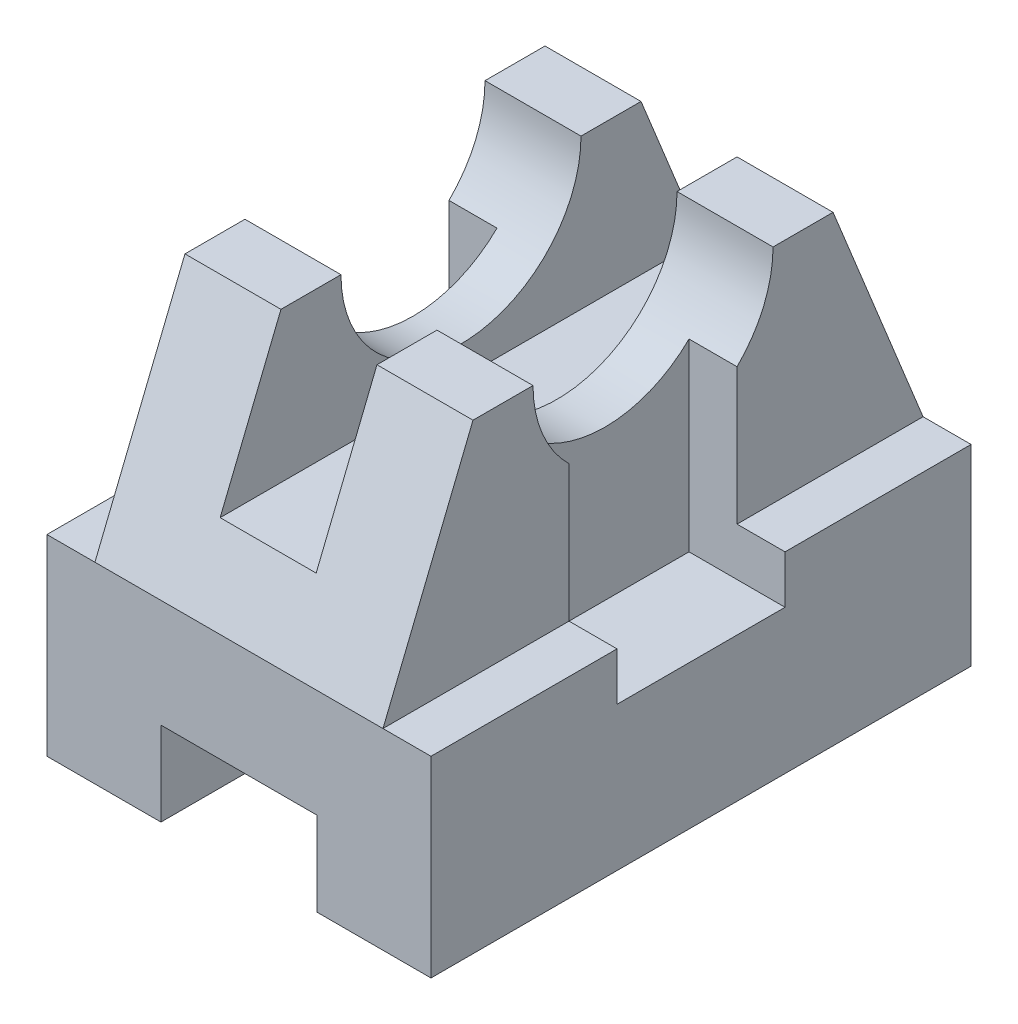
ISO-10303-21;
HEADER;
FILE_DESCRIPTION(('STEP AP214'),'2;1');
FILE_NAME('part.step','',(''),(''),'','','');
FILE_SCHEMA(('AUTOMOTIVE_DESIGN { 1 0 10303 214 1 1 1 1 }'));
ENDSEC;
DATA;
#1=APPLICATION_CONTEXT('core data for automotive mechanical design processes');
#2=APPLICATION_PROTOCOL_DEFINITION('international standard','automotive_design',2000,#1);
#3=PRODUCT_CONTEXT('',#1,'mechanical');
#4=PRODUCT('Part','Part','',(#3));
#5=PRODUCT_RELATED_PRODUCT_CATEGORY('part','',(#4));
#6=PRODUCT_DEFINITION_FORMATION('','',#4);
#7=PRODUCT_DEFINITION_CONTEXT('part definition',#1,'design');
#8=PRODUCT_DEFINITION('design','',#6,#7);
#9=PRODUCT_DEFINITION_SHAPE('','',#8);
#10=(LENGTH_UNIT() NAMED_UNIT(*) SI_UNIT(.MILLI.,.METRE.));
#11=(NAMED_UNIT(*) PLANE_ANGLE_UNIT() SI_UNIT($,.RADIAN.));
#12=(NAMED_UNIT(*) SI_UNIT($,.STERADIAN.) SOLID_ANGLE_UNIT());
#13=UNCERTAINTY_MEASURE_WITH_UNIT(LENGTH_MEASURE(1.E-05),#10,'distance_accuracy_value','');
#14=(GEOMETRIC_REPRESENTATION_CONTEXT(3) GLOBAL_UNCERTAINTY_ASSIGNED_CONTEXT((#13)) GLOBAL_UNIT_ASSIGNED_CONTEXT((#10,
#11,#12)) REPRESENTATION_CONTEXT('',''));
#15=CARTESIAN_POINT('',(0.,0.,0.));
#16=DIRECTION('',(0.,0.,1.));
#17=DIRECTION('',(1.,0.,0.));
#18=AXIS2_PLACEMENT_3D('',#15,#16,#17);
#19=CARTESIAN_POINT('',(32.,32.,45.));
#20=DIRECTION('',(0.,-1.,0.));
#21=DIRECTION('',(0.,0.,-1.));
#22=AXIS2_PLACEMENT_3D('',#19,#20,#21);
#23=PLANE('',#22);
#24=DIRECTION('',(-1.,0.,0.));
#25=VECTOR('',#24,1.);
#26=CARTESIAN_POINT('',(32.,32.,-14.));
#27=LINE('',#26,#25);
#28=CARTESIAN_POINT('',(32.,32.,-14.));
#29=VERTEX_POINT('',#28);
#30=CARTESIAN_POINT('',(24.,32.,-14.));
#31=VERTEX_POINT('',#30);
#32=EDGE_CURVE('E312',#29,#31,#27,.T.);
#33=ORIENTED_EDGE('',*,*,#32,.F.);
#34=DIRECTION('',(0.,0.,-1.));
#35=VECTOR('',#34,1.);
#36=CARTESIAN_POINT('',(32.,32.,45.));
#37=LINE('',#36,#35);
#38=CARTESIAN_POINT('',(32.,32.,-45.));
#39=VERTEX_POINT('',#38);
#40=EDGE_CURVE('E446',#29,#39,#37,.T.);
#41=ORIENTED_EDGE('',*,*,#40,.T.);
#42=DIRECTION('',(-1.,0.,0.));
#43=VECTOR('',#42,1.);
#44=CARTESIAN_POINT('',(32.,32.,-45.));
#45=LINE('',#44,#43);
#46=CARTESIAN_POINT('',(24.,32.,-45.));
#47=VERTEX_POINT('',#46);
#48=EDGE_CURVE('E408',#39,#47,#45,.T.);
#49=ORIENTED_EDGE('',*,*,#48,.T.);
#50=DIRECTION('',(0.,0.,-1.));
#51=VECTOR('',#50,1.);
#52=CARTESIAN_POINT('',(24.,32.,45.));
#53=LINE('',#52,#51);
#54=EDGE_CURVE('E370',#31,#47,#53,.T.);
#55=ORIENTED_EDGE('',*,*,#54,.F.);
#56=EDGE_LOOP('',(#33,#41,#49,#55));
#57=FACE_BOUND('',#56,.T.);
#58=ADVANCED_FACE('F43',(#57),#23,.F.);
#59=DIRECTION('',(-1.,0.,0.));
#60=VECTOR('',#59,1.);
#61=CARTESIAN_POINT('',(32.,32.,-14.));
#62=LINE('',#61,#60);
#63=CARTESIAN_POINT('',(-24.,32.,-14.));
#64=VERTEX_POINT('',#63);
#65=CARTESIAN_POINT('',(-32.,32.,-14.));
#66=VERTEX_POINT('',#65);
#67=EDGE_CURVE('E260',#64,#66,#62,.T.);
#68=ORIENTED_EDGE('',*,*,#67,.F.);
#69=DIRECTION('',(0.,0.,-1.));
#70=VECTOR('',#69,1.);
#71=CARTESIAN_POINT('',(-24.,32.,45.));
#72=LINE('',#71,#70);
#73=CARTESIAN_POINT('',(-24.,32.,-45.));
#74=VERTEX_POINT('',#73);
#75=EDGE_CURVE('E381',#64,#74,#72,.T.);
#76=ORIENTED_EDGE('',*,*,#75,.T.);
#77=CARTESIAN_POINT('',(-32.,32.,-45.));
#78=VERTEX_POINT('',#77);
#79=EDGE_CURVE('E442',#74,#78,#45,.T.);
#80=ORIENTED_EDGE('',*,*,#79,.T.);
#81=DIRECTION('',(0.,0.,-1.));
#82=VECTOR('',#81,1.);
#83=CARTESIAN_POINT('',(-32.,32.,45.));
#84=LINE('',#83,#82);
#85=EDGE_CURVE('E422',#66,#78,#84,.T.);
#86=ORIENTED_EDGE('',*,*,#85,.F.);
#87=EDGE_LOOP('',(#68,#76,#80,#86));
#88=FACE_BOUND('',#87,.T.);
#89=ADVANCED_FACE('F560',(#88),#23,.F.);
#90=CARTESIAN_POINT('',(24.,0.,0.));
#91=DIRECTION('',(1.,0.,0.));
#92=DIRECTION('',(0.,0.,-1.));
#93=AXIS2_PLACEMENT_3D('',#90,#91,#92);
#94=PLANE('',#93);
#95=CARTESIAN_POINT('',(24.,69.,0.));
#96=DIRECTION('',(1.,0.,0.));
#97=DIRECTION('',(0.,0.,-1.));
#98=AXIS2_PLACEMENT_3D('',#95,#96,#97);
#99=CIRCLE('',#98,20.);
#100=CARTESIAN_POINT('',(24.,54.7171431429143,-14.));
#101=VERTEX_POINT('',#100);
#102=CARTESIAN_POINT('',(24.,69.,-20.));
#103=VERTEX_POINT('',#102);
#104=EDGE_CURVE('E320',#101,#103,#99,.T.);
#105=ORIENTED_EDGE('',*,*,#104,.F.);
#106=DIRECTION('',(0.,-1.,0.));
#107=VECTOR('',#106,1.);
#108=CARTESIAN_POINT('',(24.,0.,-14.));
#109=LINE('',#108,#107);
#110=EDGE_CURVE('E315',#101,#31,#109,.T.);
#111=ORIENTED_EDGE('',*,*,#110,.T.);
#112=ORIENTED_EDGE('',*,*,#54,.T.);
#113=DIRECTION('',(0.,0.926739268223405,0.375705108739218));
#114=VECTOR('',#113,1.);
#115=CARTESIAN_POINT('',(24.,32.,-45.));
#116=LINE('',#115,#114);
#117=CARTESIAN_POINT('',(24.,69.,-30.));
#118=VERTEX_POINT('',#117);
#119=EDGE_CURVE('E375',#47,#118,#116,.T.);
#120=ORIENTED_EDGE('',*,*,#119,.T.);
#121=DIRECTION('',(0.,0.,1.));
#122=VECTOR('',#121,1.);
#123=CARTESIAN_POINT('',(24.,69.,-30.));
#124=LINE('',#123,#122);
#125=EDGE_CURVE('E374',#118,#103,#124,.T.);
#126=ORIENTED_EDGE('',*,*,#125,.T.);
#127=EDGE_LOOP('',(#105,#111,#112,#120,#126));
#128=FACE_BOUND('',#127,.T.);
#129=ADVANCED_FACE('F504',(#128),#94,.T.);
#130=CARTESIAN_POINT('',(-24.,0.,0.));
#131=DIRECTION('',(1.,0.,0.));
#132=DIRECTION('',(0.,0.,-1.));
#133=AXIS2_PLACEMENT_3D('',#130,#131,#132);
#134=PLANE('',#133);
#135=DIRECTION('',(0.,-1.,0.));
#136=VECTOR('',#135,1.);
#137=CARTESIAN_POINT('',(-24.,0.,-14.));
#138=LINE('',#137,#136);
#139=CARTESIAN_POINT('',(-24.,54.7171431429143,-14.));
#140=VERTEX_POINT('',#139);
#141=EDGE_CURVE('E303',#140,#64,#138,.T.);
#142=ORIENTED_EDGE('',*,*,#141,.F.);
#143=CARTESIAN_POINT('',(-24.,69.,0.));
#144=DIRECTION('',(1.,0.,0.));
#145=DIRECTION('',(0.,0.,-1.));
#146=AXIS2_PLACEMENT_3D('',#143,#144,#145);
#147=CIRCLE('',#146,20.);
#148=CARTESIAN_POINT('',(-24.,69.,-20.));
#149=VERTEX_POINT('',#148);
#150=EDGE_CURVE('E336',#140,#149,#147,.T.);
#151=ORIENTED_EDGE('',*,*,#150,.T.);
#152=DIRECTION('',(0.,0.,1.));
#153=VECTOR('',#152,1.);
#154=CARTESIAN_POINT('',(-24.,69.,-30.));
#155=LINE('',#154,#153);
#156=CARTESIAN_POINT('',(-24.,69.,-30.));
#157=VERTEX_POINT('',#156);
#158=EDGE_CURVE('E366',#157,#149,#155,.T.);
#159=ORIENTED_EDGE('',*,*,#158,.F.);
#160=DIRECTION('',(0.,0.926739268223405,0.375705108739218));
#161=VECTOR('',#160,1.);
#162=CARTESIAN_POINT('',(-24.,32.,-45.));
#163=LINE('',#162,#161);
#164=EDGE_CURVE('E384',#74,#157,#163,.T.);
#165=ORIENTED_EDGE('',*,*,#164,.F.);
#166=ORIENTED_EDGE('',*,*,#75,.F.);
#167=EDGE_LOOP('',(#142,#151,#159,#165,#166));
#168=FACE_BOUND('',#167,.T.);
#169=ADVANCED_FACE('F616',(#168),#134,.F.);
#170=CARTESIAN_POINT('',(-32.,69.,0.));
#171=DIRECTION('',(1.,0.,0.));
#172=DIRECTION('',(0.,0.,-1.));
#173=AXIS2_PLACEMENT_3D('',#170,#171,#172);
#174=CYLINDRICAL_SURFACE('',#173,20.);
#175=DIRECTION('',(1.,0.,0.));
#176=VECTOR('',#175,1.);
#177=CARTESIAN_POINT('',(-32.,54.7171431429143,-14.));
#178=LINE('',#177,#176);
#179=CARTESIAN_POINT('',(16.,54.7171431429143,-14.));
#180=VERTEX_POINT('',#179);
#181=EDGE_CURVE('E11',#101,#180,#178,.F.);
#182=ORIENTED_EDGE('',*,*,#181,.F.);
#183=ORIENTED_EDGE('',*,*,#104,.T.);
#184=DIRECTION('',(1.,0.,0.));
#185=VECTOR('',#184,1.);
#186=CARTESIAN_POINT('',(-32.,69.,-20.));
#187=LINE('',#186,#185);
#188=CARTESIAN_POINT('',(8.,69.,-20.));
#189=VERTEX_POINT('',#188);
#190=EDGE_CURVE('E322',#189,#103,#187,.T.);
#191=ORIENTED_EDGE('',*,*,#190,.F.);
#192=CARTESIAN_POINT('',(8.,69.,0.));
#193=DIRECTION('',(1.,0.,0.));
#194=DIRECTION('',(0.,0.,-1.));
#195=AXIS2_PLACEMENT_3D('',#192,#193,#194);
#196=CIRCLE('',#195,20.);
#197=CARTESIAN_POINT('',(8.,69.,20.));
#198=VERTEX_POINT('',#197);
#199=EDGE_CURVE('E480',#198,#189,#196,.T.);
#200=ORIENTED_EDGE('',*,*,#199,.F.);
#201=DIRECTION('',(1.,0.,0.));
#202=VECTOR('',#201,1.);
#203=CARTESIAN_POINT('',(-32.,69.,20.));
#204=LINE('',#203,#202);
#205=CARTESIAN_POINT('',(24.,69.,20.));
#206=VERTEX_POINT('',#205);
#207=EDGE_CURVE('E321',#206,#198,#204,.F.);
#208=ORIENTED_EDGE('',*,*,#207,.F.);
#209=CARTESIAN_POINT('',(24.,54.7171431429143,14.));
#210=VERTEX_POINT('',#209);
#211=EDGE_CURVE('E318',#206,#210,#99,.T.);
#212=ORIENTED_EDGE('',*,*,#211,.T.);
#213=DIRECTION('',(1.,0.,0.));
#214=VECTOR('',#213,1.);
#215=CARTESIAN_POINT('',(-32.,54.7171431429143,14.));
#216=LINE('',#215,#214);
#217=CARTESIAN_POINT('',(16.,54.7171431429143,14.));
#218=VERTEX_POINT('',#217);
#219=EDGE_CURVE('E490',#210,#218,#216,.F.);
#220=ORIENTED_EDGE('',*,*,#219,.T.);
#221=CARTESIAN_POINT('',(16.,69.,0.));
#222=DIRECTION('',(-1.,0.,0.));
#223=DIRECTION('',(0.,0.,1.));
#224=AXIS2_PLACEMENT_3D('',#221,#222,#223);
#225=CIRCLE('',#224,20.);
#226=EDGE_CURVE('E51',#218,#180,#225,.F.);
#227=ORIENTED_EDGE('',*,*,#226,.T.);
#228=EDGE_LOOP('',(#182,#183,#191,#200,#208,#212,#220,#227));
#229=FACE_BOUND('',#228,.T.);
#230=ADVANCED_FACE('F495',(#229),#174,.F.);
#231=DIRECTION('',(1.,0.,0.));
#232=VECTOR('',#231,1.);
#233=CARTESIAN_POINT('',(-32.,54.7171431429143,-14.));
#234=LINE('',#233,#232);
#235=CARTESIAN_POINT('',(-16.,54.7171431429143,-14.));
#236=VERTEX_POINT('',#235);
#237=EDGE_CURVE('E484',#236,#140,#234,.F.);
#238=ORIENTED_EDGE('',*,*,#237,.F.);
#239=CARTESIAN_POINT('',(-16.,69.,0.));
#240=DIRECTION('',(1.,0.,0.));
#241=DIRECTION('',(0.,0.,-1.));
#242=AXIS2_PLACEMENT_3D('',#239,#240,#241);
#243=CIRCLE('',#242,20.);
#244=CARTESIAN_POINT('',(-16.,54.7171431429143,14.));
#245=VERTEX_POINT('',#244);
#246=EDGE_CURVE('E485',#236,#245,#243,.F.);
#247=ORIENTED_EDGE('',*,*,#246,.T.);
#248=DIRECTION('',(1.,0.,0.));
#249=VECTOR('',#248,1.);
#250=CARTESIAN_POINT('',(-32.,54.7171431429143,14.));
#251=LINE('',#250,#249);
#252=CARTESIAN_POINT('',(-24.,54.7171431429143,14.));
#253=VERTEX_POINT('',#252);
#254=EDGE_CURVE('E477',#245,#253,#251,.F.);
#255=ORIENTED_EDGE('',*,*,#254,.T.);
#256=CARTESIAN_POINT('',(-24.,69.,20.));
#257=VERTEX_POINT('',#256);
#258=EDGE_CURVE('E340',#257,#253,#147,.T.);
#259=ORIENTED_EDGE('',*,*,#258,.F.);
#260=DIRECTION('',(1.,0.,0.));
#261=VECTOR('',#260,1.);
#262=CARTESIAN_POINT('',(-32.,69.,20.));
#263=LINE('',#262,#261);
#264=CARTESIAN_POINT('',(-8.,69.,20.));
#265=VERTEX_POINT('',#264);
#266=EDGE_CURVE('E329',#265,#257,#263,.F.);
#267=ORIENTED_EDGE('',*,*,#266,.F.);
#268=CARTESIAN_POINT('',(-8.,69.,0.));
#269=DIRECTION('',(-1.,0.,0.));
#270=DIRECTION('',(0.,0.,1.));
#271=AXIS2_PLACEMENT_3D('',#268,#269,#270);
#272=CIRCLE('',#271,20.);
#273=CARTESIAN_POINT('',(-8.,69.,-20.));
#274=VERTEX_POINT('',#273);
#275=EDGE_CURVE('E330',#274,#265,#272,.T.);
#276=ORIENTED_EDGE('',*,*,#275,.F.);
#277=DIRECTION('',(1.,0.,0.));
#278=VECTOR('',#277,1.);
#279=CARTESIAN_POINT('',(-32.,69.,-20.));
#280=LINE('',#279,#278);
#281=EDGE_CURVE('E334',#149,#274,#280,.T.);
#282=ORIENTED_EDGE('',*,*,#281,.F.);
#283=ORIENTED_EDGE('',*,*,#150,.F.);
#284=EDGE_LOOP('',(#238,#247,#255,#259,#267,#276,#282,#283));
#285=FACE_BOUND('',#284,.T.);
#286=ADVANCED_FACE('F603',(#285),#174,.F.);
#287=CARTESIAN_POINT('',(24.,69.,-30.));
#288=DIRECTION('',(0.,-1.,0.));
#289=DIRECTION('',(0.,0.,-1.));
#290=AXIS2_PLACEMENT_3D('',#287,#288,#289);
#291=PLANE('',#290);
#292=ORIENTED_EDGE('',*,*,#158,.T.);
#293=ORIENTED_EDGE('',*,*,#281,.T.);
#294=DIRECTION('',(0.,0.,1.));
#295=VECTOR('',#294,1.);
#296=CARTESIAN_POINT('',(-8.,69.,-45.));
#297=LINE('',#296,#295);
#298=CARTESIAN_POINT('',(-8.,69.,-30.));
#299=VERTEX_POINT('',#298);
#300=EDGE_CURVE('E341',#299,#274,#297,.T.);
#301=ORIENTED_EDGE('',*,*,#300,.F.);
#302=DIRECTION('',(-1.,0.,0.));
#303=VECTOR('',#302,1.);
#304=CARTESIAN_POINT('',(24.,69.,-30.));
#305=LINE('',#304,#303);
#306=EDGE_CURVE('E393',#299,#157,#305,.T.);
#307=ORIENTED_EDGE('',*,*,#306,.T.);
#308=EDGE_LOOP('',(#292,#293,#301,#307));
#309=FACE_BOUND('',#308,.T.);
#310=ADVANCED_FACE('F595',(#309),#291,.F.);
#311=DIRECTION('',(0.,0.,1.));
#312=VECTOR('',#311,1.);
#313=CARTESIAN_POINT('',(8.,69.,-45.));
#314=LINE('',#313,#312);
#315=CARTESIAN_POINT('',(8.,69.,-30.));
#316=VERTEX_POINT('',#315);
#317=EDGE_CURVE('E347',#316,#189,#314,.T.);
#318=ORIENTED_EDGE('',*,*,#317,.T.);
#319=ORIENTED_EDGE('',*,*,#190,.T.);
#320=ORIENTED_EDGE('',*,*,#125,.F.);
#321=EDGE_CURVE('E394',#118,#316,#305,.T.);
#322=ORIENTED_EDGE('',*,*,#321,.T.);
#323=EDGE_LOOP('',(#318,#319,#320,#322));
#324=FACE_BOUND('',#323,.T.);
#325=ADVANCED_FACE('F523',(#324),#291,.F.);
#326=CARTESIAN_POINT('',(-8.,69.,30.));
#327=VERTEX_POINT('',#326);
#328=EDGE_CURVE('E344',#265,#327,#297,.T.);
#329=ORIENTED_EDGE('',*,*,#328,.F.);
#330=ORIENTED_EDGE('',*,*,#266,.T.);
#331=CARTESIAN_POINT('',(-24.,69.,30.));
#332=VERTEX_POINT('',#331);
#333=EDGE_CURVE('E389',#257,#332,#155,.T.);
#334=ORIENTED_EDGE('',*,*,#333,.T.);
#335=DIRECTION('',(-1.,0.,0.));
#336=VECTOR('',#335,1.);
#337=CARTESIAN_POINT('',(24.,69.,30.));
#338=LINE('',#337,#336);
#339=EDGE_CURVE('E378',#327,#332,#338,.T.);
#340=ORIENTED_EDGE('',*,*,#339,.F.);
#341=EDGE_LOOP('',(#329,#330,#334,#340));
#342=FACE_BOUND('',#341,.T.);
#343=ADVANCED_FACE('F578',(#342),#291,.F.);
#344=CARTESIAN_POINT('',(32.,32.,45.));
#345=VERTEX_POINT('',#344);
#346=CARTESIAN_POINT('',(32.,32.,14.));
#347=VERTEX_POINT('',#346);
#348=EDGE_CURVE('E450',#345,#347,#37,.T.);
#349=ORIENTED_EDGE('',*,*,#348,.T.);
#350=DIRECTION('',(-1.,0.,0.));
#351=VECTOR('',#350,1.);
#352=CARTESIAN_POINT('',(32.,32.,14.));
#353=LINE('',#352,#351);
#354=CARTESIAN_POINT('',(24.,32.,14.));
#355=VERTEX_POINT('',#354);
#356=EDGE_CURVE('E310',#347,#355,#353,.T.);
#357=ORIENTED_EDGE('',*,*,#356,.T.);
#358=CARTESIAN_POINT('',(24.,32.,45.));
#359=VERTEX_POINT('',#358);
#360=EDGE_CURVE('E369',#359,#355,#53,.T.);
#361=ORIENTED_EDGE('',*,*,#360,.F.);
#362=DIRECTION('',(-1.,0.,0.));
#363=VECTOR('',#362,1.);
#364=CARTESIAN_POINT('',(32.,32.,45.));
#365=LINE('',#364,#363);
#366=EDGE_CURVE('E425',#345,#359,#365,.T.);
#367=ORIENTED_EDGE('',*,*,#366,.F.);
#368=EDGE_LOOP('',(#349,#357,#361,#367));
#369=FACE_BOUND('',#368,.T.);
#370=ADVANCED_FACE('F541',(#369),#23,.F.);
#371=CARTESIAN_POINT('',(-32.,32.,45.));
#372=DIRECTION('',(1.,0.,0.));
#373=DIRECTION('',(0.,0.,-1.));
#374=AXIS2_PLACEMENT_3D('',#371,#372,#373);
#375=PLANE('',#374);
#376=CARTESIAN_POINT('',(-32.,32.,45.));
#377=VERTEX_POINT('',#376);
#378=CARTESIAN_POINT('',(-32.,32.,14.));
#379=VERTEX_POINT('',#378);
#380=EDGE_CURVE('E441',#377,#379,#84,.T.);
#381=ORIENTED_EDGE('',*,*,#380,.T.);
#382=DIRECTION('',(0.,-1.,0.));
#383=VECTOR('',#382,1.);
#384=CARTESIAN_POINT('',(-32.,69.,14.));
#385=LINE('',#384,#383);
#386=CARTESIAN_POINT('',(-32.,24.,14.));
#387=VERTEX_POINT('',#386);
#388=EDGE_CURVE('E273',#379,#387,#385,.T.);
#389=ORIENTED_EDGE('',*,*,#388,.T.);
#390=DIRECTION('',(0.,0.,1.));
#391=VECTOR('',#390,1.);
#392=CARTESIAN_POINT('',(-32.,24.,-14.));
#393=LINE('',#392,#391);
#394=CARTESIAN_POINT('',(-32.,24.,-14.));
#395=VERTEX_POINT('',#394);
#396=EDGE_CURVE('E266',#395,#387,#393,.T.);
#397=ORIENTED_EDGE('',*,*,#396,.F.);
#398=DIRECTION('',(0.,-1.,0.));
#399=VECTOR('',#398,1.);
#400=CARTESIAN_POINT('',(-32.,69.,-14.));
#401=LINE('',#400,#399);
#402=EDGE_CURVE('E253',#66,#395,#401,.T.);
#403=ORIENTED_EDGE('',*,*,#402,.F.);
#404=ORIENTED_EDGE('',*,*,#85,.T.);
#405=DIRECTION('',(0.,-1.,0.));
#406=VECTOR('',#405,1.);
#407=CARTESIAN_POINT('',(-32.,32.,-45.));
#408=LINE('',#407,#406);
#409=CARTESIAN_POINT('',(-32.,0.,-45.));
#410=VERTEX_POINT('',#409);
#411=EDGE_CURVE('E404',#78,#410,#408,.T.);
#412=ORIENTED_EDGE('',*,*,#411,.T.);
#413=DIRECTION('',(0.,0.,-1.));
#414=VECTOR('',#413,1.);
#415=CARTESIAN_POINT('',(-32.,0.,45.));
#416=LINE('',#415,#414);
#417=CARTESIAN_POINT('',(-32.,0.,45.));
#418=VERTEX_POINT('',#417);
#419=EDGE_CURVE('E464',#418,#410,#416,.T.);
#420=ORIENTED_EDGE('',*,*,#419,.F.);
#421=DIRECTION('',(0.,-1.,0.));
#422=VECTOR('',#421,1.);
#423=CARTESIAN_POINT('',(-32.,32.,45.));
#424=LINE('',#423,#422);
#425=EDGE_CURVE('E403',#377,#418,#424,.T.);
#426=ORIENTED_EDGE('',*,*,#425,.F.);
#427=EDGE_LOOP('',(#381,#389,#397,#403,#404,#412,#420,#426));
#428=FACE_BOUND('',#427,.T.);
#429=ADVANCED_FACE('F44',(#428),#375,.F.);
#430=CARTESIAN_POINT('',(-32.,0.,45.));
#431=DIRECTION('',(0.,1.,0.));
#432=DIRECTION('',(0.,0.,1.));
#433=AXIS2_PLACEMENT_3D('',#430,#431,#432);
#434=PLANE('',#433);
#435=DIRECTION('',(1.,0.,0.));
#436=VECTOR('',#435,1.);
#437=CARTESIAN_POINT('',(-32.,0.,-45.));
#438=LINE('',#437,#436);
#439=CARTESIAN_POINT('',(-13.,0.,-45.));
#440=VERTEX_POINT('',#439);
#441=EDGE_CURVE('E428',#410,#440,#438,.T.);
#442=ORIENTED_EDGE('',*,*,#441,.T.);
#443=DIRECTION('',(0.,0.,-1.));
#444=VECTOR('',#443,1.);
#445=CARTESIAN_POINT('',(-13.,0.,45.));
#446=LINE('',#445,#444);
#447=CARTESIAN_POINT('',(-13.,0.,45.));
#448=VERTEX_POINT('',#447);
#449=EDGE_CURVE('E465',#448,#440,#446,.T.);
#450=ORIENTED_EDGE('',*,*,#449,.F.);
#451=DIRECTION('',(1.,0.,0.));
#452=VECTOR('',#451,1.);
#453=CARTESIAN_POINT('',(-32.,0.,45.));
#454=LINE('',#453,#452);
#455=EDGE_CURVE('E407',#418,#448,#454,.T.);
#456=ORIENTED_EDGE('',*,*,#455,.F.);
#457=ORIENTED_EDGE('',*,*,#419,.T.);
#458=EDGE_LOOP('',(#442,#450,#456,#457));
#459=FACE_BOUND('',#458,.T.);
#460=ADVANCED_FACE('F585',(#459),#434,.F.);
#461=CARTESIAN_POINT('',(-13.,0.,45.));
#462=DIRECTION('',(-1.,0.,0.));
#463=DIRECTION('',(0.,0.,1.));
#464=AXIS2_PLACEMENT_3D('',#461,#462,#463);
#465=PLANE('',#464);
#466=DIRECTION('',(0.,1.,0.));
#467=VECTOR('',#466,1.);
#468=CARTESIAN_POINT('',(-13.,0.,-45.));
#469=LINE('',#468,#467);
#470=CARTESIAN_POINT('',(-13.,14.,-45.));
#471=VERTEX_POINT('',#470);
#472=EDGE_CURVE('E429',#440,#471,#469,.T.);
#473=ORIENTED_EDGE('',*,*,#472,.T.);
#474=DIRECTION('',(0.,0.,-1.));
#475=VECTOR('',#474,1.);
#476=CARTESIAN_POINT('',(-13.,14.,45.));
#477=LINE('',#476,#475);
#478=CARTESIAN_POINT('',(-13.,14.,45.));
#479=VERTEX_POINT('',#478);
#480=EDGE_CURVE('E459',#479,#471,#477,.T.);
#481=ORIENTED_EDGE('',*,*,#480,.F.);
#482=DIRECTION('',(0.,1.,0.));
#483=VECTOR('',#482,1.);
#484=CARTESIAN_POINT('',(-13.,0.,45.));
#485=LINE('',#484,#483);
#486=EDGE_CURVE('E411',#448,#479,#485,.T.);
#487=ORIENTED_EDGE('',*,*,#486,.F.);
#488=ORIENTED_EDGE('',*,*,#449,.T.);
#489=EDGE_LOOP('',(#473,#481,#487,#488));
#490=FACE_BOUND('',#489,.T.);
#491=ADVANCED_FACE('F839',(#490),#465,.F.);
#492=CARTESIAN_POINT('',(-13.,14.,45.));
#493=DIRECTION('',(0.,1.,0.));
#494=DIRECTION('',(0.,0.,1.));
#495=AXIS2_PLACEMENT_3D('',#492,#493,#494);
#496=PLANE('',#495);
#497=DIRECTION('',(1.,0.,0.));
#498=VECTOR('',#497,1.);
#499=CARTESIAN_POINT('',(-13.,14.,-45.));
#500=LINE('',#499,#498);
#501=CARTESIAN_POINT('',(13.,14.,-45.));
#502=VERTEX_POINT('',#501);
#503=EDGE_CURVE('E435',#471,#502,#500,.T.);
#504=ORIENTED_EDGE('',*,*,#503,.T.);
#505=DIRECTION('',(0.,0.,-1.));
#506=VECTOR('',#505,1.);
#507=CARTESIAN_POINT('',(13.,14.,45.));
#508=LINE('',#507,#506);
#509=CARTESIAN_POINT('',(13.,14.,45.));
#510=VERTEX_POINT('',#509);
#511=EDGE_CURVE('E457',#510,#502,#508,.T.);
#512=ORIENTED_EDGE('',*,*,#511,.F.);
#513=DIRECTION('',(1.,0.,0.));
#514=VECTOR('',#513,1.);
#515=CARTESIAN_POINT('',(-13.,14.,45.));
#516=LINE('',#515,#514);
#517=EDGE_CURVE('E412',#479,#510,#516,.T.);
#518=ORIENTED_EDGE('',*,*,#517,.F.);
#519=ORIENTED_EDGE('',*,*,#480,.T.);
#520=EDGE_LOOP('',(#504,#512,#518,#519));
#521=FACE_BOUND('',#520,.T.);
#522=ADVANCED_FACE('F831',(#521),#496,.F.);
#523=CARTESIAN_POINT('',(13.,14.,45.));
#524=DIRECTION('',(1.,0.,0.));
#525=DIRECTION('',(0.,0.,-1.));
#526=AXIS2_PLACEMENT_3D('',#523,#524,#525);
#527=PLANE('',#526);
#528=DIRECTION('',(0.,-1.,0.));
#529=VECTOR('',#528,1.);
#530=CARTESIAN_POINT('',(13.,14.,-45.));
#531=LINE('',#530,#529);
#532=CARTESIAN_POINT('',(13.,0.,-45.));
#533=VERTEX_POINT('',#532);
#534=EDGE_CURVE('E432',#502,#533,#531,.T.);
#535=ORIENTED_EDGE('',*,*,#534,.T.);
#536=DIRECTION('',(0.,0.,-1.));
#537=VECTOR('',#536,1.);
#538=CARTESIAN_POINT('',(13.,0.,45.));
#539=LINE('',#538,#537);
#540=CARTESIAN_POINT('',(13.,0.,45.));
#541=VERTEX_POINT('',#540);
#542=EDGE_CURVE('E452',#541,#533,#539,.T.);
#543=ORIENTED_EDGE('',*,*,#542,.F.);
#544=DIRECTION('',(0.,-1.,0.));
#545=VECTOR('',#544,1.);
#546=CARTESIAN_POINT('',(13.,14.,45.));
#547=LINE('',#546,#545);
#548=EDGE_CURVE('E414',#510,#541,#547,.T.);
#549=ORIENTED_EDGE('',*,*,#548,.F.);
#550=ORIENTED_EDGE('',*,*,#511,.T.);
#551=EDGE_LOOP('',(#535,#543,#549,#550));
#552=FACE_BOUND('',#551,.T.);
#553=ADVANCED_FACE('F825',(#552),#527,.F.);
#554=CARTESIAN_POINT('',(13.,0.,45.));
#555=DIRECTION('',(0.,1.,0.));
#556=DIRECTION('',(0.,0.,1.));
#557=AXIS2_PLACEMENT_3D('',#554,#555,#556);
#558=PLANE('',#557);
#559=DIRECTION('',(1.,0.,0.));
#560=VECTOR('',#559,1.);
#561=CARTESIAN_POINT('',(13.,0.,-45.));
#562=LINE('',#561,#560);
#563=CARTESIAN_POINT('',(32.,0.,-45.));
#564=VERTEX_POINT('',#563);
#565=EDGE_CURVE('E436',#533,#564,#562,.T.);
#566=ORIENTED_EDGE('',*,*,#565,.T.);
#567=DIRECTION('',(0.,0.,-1.));
#568=VECTOR('',#567,1.);
#569=CARTESIAN_POINT('',(32.,0.,45.));
#570=LINE('',#569,#568);
#571=CARTESIAN_POINT('',(32.,0.,45.));
#572=VERTEX_POINT('',#571);
#573=EDGE_CURVE('E449',#572,#564,#570,.T.);
#574=ORIENTED_EDGE('',*,*,#573,.F.);
#575=DIRECTION('',(1.,0.,0.));
#576=VECTOR('',#575,1.);
#577=CARTESIAN_POINT('',(13.,0.,45.));
#578=LINE('',#577,#576);
#579=EDGE_CURVE('E417',#541,#572,#578,.T.);
#580=ORIENTED_EDGE('',*,*,#579,.F.);
#581=ORIENTED_EDGE('',*,*,#542,.T.);
#582=EDGE_LOOP('',(#566,#574,#580,#581));
#583=FACE_BOUND('',#582,.T.);
#584=ADVANCED_FACE('F580',(#583),#558,.F.);
#585=CARTESIAN_POINT('',(32.,0.,45.));
#586=DIRECTION('',(-1.,0.,0.));
#587=DIRECTION('',(0.,0.,1.));
#588=AXIS2_PLACEMENT_3D('',#585,#586,#587);
#589=PLANE('',#588);
#590=DIRECTION('',(0.,0.,1.));
#591=VECTOR('',#590,1.);
#592=CARTESIAN_POINT('',(32.,24.,-14.));
#593=LINE('',#592,#591);
#594=CARTESIAN_POINT('',(32.,24.,-14.));
#595=VERTEX_POINT('',#594);
#596=CARTESIAN_POINT('',(32.,24.,14.));
#597=VERTEX_POINT('',#596);
#598=EDGE_CURVE('E283',#595,#597,#593,.T.);
#599=ORIENTED_EDGE('',*,*,#598,.T.);
#600=DIRECTION('',(0.,1.,0.));
#601=VECTOR('',#600,1.);
#602=CARTESIAN_POINT('',(32.,24.,14.));
#603=LINE('',#602,#601);
#604=EDGE_CURVE('E290',#597,#347,#603,.T.);
#605=ORIENTED_EDGE('',*,*,#604,.T.);
#606=ORIENTED_EDGE('',*,*,#348,.F.);
#607=DIRECTION('',(0.,1.,0.));
#608=VECTOR('',#607,1.);
#609=CARTESIAN_POINT('',(32.,0.,45.));
#610=LINE('',#609,#608);
#611=EDGE_CURVE('E420',#572,#345,#610,.T.);
#612=ORIENTED_EDGE('',*,*,#611,.F.);
#613=ORIENTED_EDGE('',*,*,#573,.T.);
#614=DIRECTION('',(0.,1.,0.));
#615=VECTOR('',#614,1.);
#616=CARTESIAN_POINT('',(32.,0.,-45.));
#617=LINE('',#616,#615);
#618=EDGE_CURVE('E437',#564,#39,#617,.T.);
#619=ORIENTED_EDGE('',*,*,#618,.T.);
#620=ORIENTED_EDGE('',*,*,#40,.F.);
#621=DIRECTION('',(0.,1.,0.));
#622=VECTOR('',#621,1.);
#623=CARTESIAN_POINT('',(32.,24.,-14.));
#624=LINE('',#623,#622);
#625=EDGE_CURVE('E282',#595,#29,#624,.T.);
#626=ORIENTED_EDGE('',*,*,#625,.F.);
#627=EDGE_LOOP('',(#599,#605,#606,#612,#613,#619,#620,#626));
#628=FACE_BOUND('',#627,.T.);
#629=ADVANCED_FACE('F546',(#628),#589,.F.);
#630=CARTESIAN_POINT('',(-24.,32.,45.));
#631=VERTEX_POINT('',#630);
#632=CARTESIAN_POINT('',(-24.,32.,14.));
#633=VERTEX_POINT('',#632);
#634=EDGE_CURVE('E385',#631,#633,#72,.T.);
#635=ORIENTED_EDGE('',*,*,#634,.T.);
#636=DIRECTION('',(-1.,0.,0.));
#637=VECTOR('',#636,1.);
#638=CARTESIAN_POINT('',(32.,32.,14.));
#639=LINE('',#638,#637);
#640=EDGE_CURVE('E301',#633,#379,#639,.T.);
#641=ORIENTED_EDGE('',*,*,#640,.T.);
#642=ORIENTED_EDGE('',*,*,#380,.F.);
#643=EDGE_CURVE('E423',#631,#377,#365,.T.);
#644=ORIENTED_EDGE('',*,*,#643,.F.);
#645=EDGE_LOOP('',(#635,#641,#642,#644));
#646=FACE_BOUND('',#645,.T.);
#647=ADVANCED_FACE('F558',(#646),#23,.F.);
#648=CARTESIAN_POINT('',(0.,0.,45.));
#649=DIRECTION('',(0.,0.,1.));
#650=DIRECTION('',(1.,0.,0.));
#651=AXIS2_PLACEMENT_3D('',#648,#649,#650);
#652=PLANE('',#651);
#653=ORIENTED_EDGE('',*,*,#425,.T.);
#654=ORIENTED_EDGE('',*,*,#455,.T.);
#655=ORIENTED_EDGE('',*,*,#486,.T.);
#656=ORIENTED_EDGE('',*,*,#517,.T.);
#657=ORIENTED_EDGE('',*,*,#548,.T.);
#658=ORIENTED_EDGE('',*,*,#579,.T.);
#659=ORIENTED_EDGE('',*,*,#611,.T.);
#660=ORIENTED_EDGE('',*,*,#366,.T.);
#661=DIRECTION('',(-1.,0.,0.));
#662=VECTOR('',#661,1.);
#663=CARTESIAN_POINT('',(24.,32.,45.));
#664=LINE('',#663,#662);
#665=EDGE_CURVE('E402',#359,#631,#664,.T.);
#666=ORIENTED_EDGE('',*,*,#665,.T.);
#667=ORIENTED_EDGE('',*,*,#643,.T.);
#668=EDGE_LOOP('',(#653,#654,#655,#656,#657,#658,#659,#660,#666,#667));
#669=FACE_BOUND('',#668,.T.);
#670=ADVANCED_FACE('F566',(#669),#652,.T.);
#671=CARTESIAN_POINT('',(0.,0.,-45.));
#672=DIRECTION('',(0.,0.,1.));
#673=DIRECTION('',(1.,0.,0.));
#674=AXIS2_PLACEMENT_3D('',#671,#672,#673);
#675=PLANE('',#674);
#676=ORIENTED_EDGE('',*,*,#411,.F.);
#677=ORIENTED_EDGE('',*,*,#79,.F.);
#678=DIRECTION('',(-1.,0.,0.));
#679=VECTOR('',#678,1.);
#680=CARTESIAN_POINT('',(24.,32.,-45.));
#681=LINE('',#680,#679);
#682=EDGE_CURVE('E397',#47,#74,#681,.T.);
#683=ORIENTED_EDGE('',*,*,#682,.F.);
#684=ORIENTED_EDGE('',*,*,#48,.F.);
#685=ORIENTED_EDGE('',*,*,#618,.F.);
#686=ORIENTED_EDGE('',*,*,#565,.F.);
#687=ORIENTED_EDGE('',*,*,#534,.F.);
#688=ORIENTED_EDGE('',*,*,#503,.F.);
#689=ORIENTED_EDGE('',*,*,#472,.F.);
#690=ORIENTED_EDGE('',*,*,#441,.F.);
#691=EDGE_LOOP('',(#676,#677,#683,#684,#685,#686,#687,#688,#689,#690));
#692=FACE_BOUND('',#691,.T.);
#693=ADVANCED_FACE('F513',(#692),#675,.F.);
#694=CARTESIAN_POINT('',(24.,69.,30.));
#695=DIRECTION('',(0.,-0.375705108739218,-0.926739268223405));
#696=DIRECTION('',(0.,0.926739268223405,-0.375705108739218));
#697=AXIS2_PLACEMENT_3D('',#694,#695,#696);
#698=PLANE('',#697);
#699=DIRECTION('',(-1.,0.,0.));
#700=VECTOR('',#699,1.);
#701=CARTESIAN_POINT('',(24.,44.,40.1351351351351));
#702=LINE('',#701,#700);
#703=CARTESIAN_POINT('',(8.,44.,40.1351351351351));
#704=VERTEX_POINT('',#703);
#705=CARTESIAN_POINT('',(-8.,44.,40.1351351351351));
#706=VERTEX_POINT('',#705);
#707=EDGE_CURVE('E343',#704,#706,#702,.T.);
#708=ORIENTED_EDGE('',*,*,#707,.T.);
#709=DIRECTION('',(0.,0.926739268223405,-0.375705108739218));
#710=VECTOR('',#709,1.);
#711=CARTESIAN_POINT('',(-8.,69.,30.));
#712=LINE('',#711,#710);
#713=EDGE_CURVE('E359',#706,#327,#712,.T.);
#714=ORIENTED_EDGE('',*,*,#713,.T.);
#715=ORIENTED_EDGE('',*,*,#339,.T.);
#716=DIRECTION('',(0.,-0.926739268223405,0.375705108739218));
#717=VECTOR('',#716,1.);
#718=CARTESIAN_POINT('',(-24.,69.,30.));
#719=LINE('',#718,#717);
#720=EDGE_CURVE('E361',#332,#631,#719,.T.);
#721=ORIENTED_EDGE('',*,*,#720,.T.);
#722=ORIENTED_EDGE('',*,*,#665,.F.);
#723=DIRECTION('',(0.,-0.926739268223405,0.375705108739218));
#724=VECTOR('',#723,1.);
#725=CARTESIAN_POINT('',(24.,69.,30.));
#726=LINE('',#725,#724);
#727=CARTESIAN_POINT('',(24.,69.,30.));
#728=VERTEX_POINT('',#727);
#729=EDGE_CURVE('E365',#728,#359,#726,.T.);
#730=ORIENTED_EDGE('',*,*,#729,.F.);
#731=CARTESIAN_POINT('',(8.,69.,30.));
#732=VERTEX_POINT('',#731);
#733=EDGE_CURVE('E391',#728,#732,#338,.T.);
#734=ORIENTED_EDGE('',*,*,#733,.T.);
#735=DIRECTION('',(0.,-0.926739268223405,0.375705108739218));
#736=VECTOR('',#735,1.);
#737=CARTESIAN_POINT('',(8.,69.,30.));
#738=LINE('',#737,#736);
#739=EDGE_CURVE('E360',#732,#704,#738,.T.);
#740=ORIENTED_EDGE('',*,*,#739,.T.);
#741=EDGE_LOOP('',(#708,#714,#715,#721,#722,#730,#734,#740));
#742=FACE_BOUND('',#741,.T.);
#743=ADVANCED_FACE('F605',(#742),#698,.F.);
#744=CARTESIAN_POINT('',(24.,32.,-45.));
#745=DIRECTION('',(0.,-0.375705108739218,0.926739268223405));
#746=DIRECTION('',(0.,-0.926739268223405,-0.375705108739218));
#747=AXIS2_PLACEMENT_3D('',#744,#745,#746);
#748=PLANE('',#747);
#749=ORIENTED_EDGE('',*,*,#306,.F.);
#750=DIRECTION('',(0.,-0.926739268223405,-0.375705108739218));
#751=VECTOR('',#750,1.);
#752=CARTESIAN_POINT('',(-8.,32.,-45.));
#753=LINE('',#752,#751);
#754=CARTESIAN_POINT('',(-8.,44.,-40.1351351351351));
#755=VERTEX_POINT('',#754);
#756=EDGE_CURVE('E475',#299,#755,#753,.T.);
#757=ORIENTED_EDGE('',*,*,#756,.T.);
#758=DIRECTION('',(1.,0.,0.));
#759=VECTOR('',#758,1.);
#760=CARTESIAN_POINT('',(24.,44.,-40.1351351351351));
#761=LINE('',#760,#759);
#762=CARTESIAN_POINT('',(8.,44.,-40.1351351351351));
#763=VERTEX_POINT('',#762);
#764=EDGE_CURVE('E467',#755,#763,#761,.T.);
#765=ORIENTED_EDGE('',*,*,#764,.T.);
#766=DIRECTION('',(0.,0.926739268223405,0.375705108739218));
#767=VECTOR('',#766,1.);
#768=CARTESIAN_POINT('',(8.,32.,-45.));
#769=LINE('',#768,#767);
#770=EDGE_CURVE('E473',#763,#316,#769,.T.);
#771=ORIENTED_EDGE('',*,*,#770,.T.);
#772=ORIENTED_EDGE('',*,*,#321,.F.);
#773=ORIENTED_EDGE('',*,*,#119,.F.);
#774=ORIENTED_EDGE('',*,*,#682,.T.);
#775=ORIENTED_EDGE('',*,*,#164,.T.);
#776=EDGE_LOOP('',(#749,#757,#765,#771,#772,#773,#774,#775));
#777=FACE_BOUND('',#776,.T.);
#778=ADVANCED_FACE('F521',(#777),#748,.F.);
#779=EDGE_CURVE('E372',#206,#728,#124,.T.);
#780=ORIENTED_EDGE('',*,*,#779,.F.);
#781=ORIENTED_EDGE('',*,*,#207,.T.);
#782=EDGE_CURVE('E349',#198,#732,#314,.T.);
#783=ORIENTED_EDGE('',*,*,#782,.T.);
#784=ORIENTED_EDGE('',*,*,#733,.F.);
#785=EDGE_LOOP('',(#780,#781,#783,#784));
#786=FACE_BOUND('',#785,.T.);
#787=ADVANCED_FACE('F531',(#786),#291,.F.);
#788=DIRECTION('',(0.,-1.,0.));
#789=VECTOR('',#788,1.);
#790=CARTESIAN_POINT('',(24.,0.,14.));
#791=LINE('',#790,#789);
#792=EDGE_CURVE('E307',#210,#355,#791,.T.);
#793=ORIENTED_EDGE('',*,*,#792,.F.);
#794=ORIENTED_EDGE('',*,*,#211,.F.);
#795=ORIENTED_EDGE('',*,*,#779,.T.);
#796=ORIENTED_EDGE('',*,*,#729,.T.);
#797=ORIENTED_EDGE('',*,*,#360,.T.);
#798=EDGE_LOOP('',(#793,#794,#795,#796,#797));
#799=FACE_BOUND('',#798,.T.);
#800=ADVANCED_FACE('F538',(#799),#94,.T.);
#801=ORIENTED_EDGE('',*,*,#258,.T.);
#802=DIRECTION('',(0.,-1.,0.));
#803=VECTOR('',#802,1.);
#804=CARTESIAN_POINT('',(-24.,0.,14.));
#805=LINE('',#804,#803);
#806=EDGE_CURVE('E66',#253,#633,#805,.T.);
#807=ORIENTED_EDGE('',*,*,#806,.T.);
#808=ORIENTED_EDGE('',*,*,#634,.F.);
#809=ORIENTED_EDGE('',*,*,#720,.F.);
#810=ORIENTED_EDGE('',*,*,#333,.F.);
#811=EDGE_LOOP('',(#801,#807,#808,#809,#810));
#812=FACE_BOUND('',#811,.T.);
#813=ADVANCED_FACE('F597',(#812),#134,.F.);
#814=CARTESIAN_POINT('',(-8.,69.,-45.));
#815=DIRECTION('',(-1.,0.,0.));
#816=DIRECTION('',(0.,0.,1.));
#817=AXIS2_PLACEMENT_3D('',#814,#815,#816);
#818=PLANE('',#817);
#819=ORIENTED_EDGE('',*,*,#300,.T.);
#820=ORIENTED_EDGE('',*,*,#275,.T.);
#821=ORIENTED_EDGE('',*,*,#328,.T.);
#822=ORIENTED_EDGE('',*,*,#713,.F.);
#823=DIRECTION('',(0.,0.,1.));
#824=VECTOR('',#823,1.);
#825=CARTESIAN_POINT('',(-8.,44.,-45.));
#826=LINE('',#825,#824);
#827=EDGE_CURVE('E339',#755,#706,#826,.T.);
#828=ORIENTED_EDGE('',*,*,#827,.F.);
#829=ORIENTED_EDGE('',*,*,#756,.F.);
#830=EDGE_LOOP('',(#819,#820,#821,#822,#828,#829));
#831=FACE_BOUND('',#830,.T.);
#832=ADVANCED_FACE('F622',(#831),#818,.F.);
#833=CARTESIAN_POINT('',(8.,44.,-45.));
#834=DIRECTION('',(1.,0.,0.));
#835=DIRECTION('',(0.,0.,-1.));
#836=AXIS2_PLACEMENT_3D('',#833,#834,#835);
#837=PLANE('',#836);
#838=ORIENTED_EDGE('',*,*,#782,.F.);
#839=ORIENTED_EDGE('',*,*,#199,.T.);
#840=ORIENTED_EDGE('',*,*,#317,.F.);
#841=ORIENTED_EDGE('',*,*,#770,.F.);
#842=DIRECTION('',(0.,0.,1.));
#843=VECTOR('',#842,1.);
#844=CARTESIAN_POINT('',(8.,44.,-45.));
#845=LINE('',#844,#843);
#846=EDGE_CURVE('E348',#763,#704,#845,.T.);
#847=ORIENTED_EDGE('',*,*,#846,.T.);
#848=ORIENTED_EDGE('',*,*,#739,.F.);
#849=EDGE_LOOP('',(#838,#839,#840,#841,#847,#848));
#850=FACE_BOUND('',#849,.T.);
#851=ADVANCED_FACE('F527',(#850),#837,.F.);
#852=CARTESIAN_POINT('',(-8.,44.,-45.));
#853=DIRECTION('',(0.,-1.,0.));
#854=DIRECTION('',(0.,0.,-1.));
#855=AXIS2_PLACEMENT_3D('',#852,#853,#854);
#856=PLANE('',#855);
#857=ORIENTED_EDGE('',*,*,#846,.F.);
#858=ORIENTED_EDGE('',*,*,#764,.F.);
#859=ORIENTED_EDGE('',*,*,#827,.T.);
#860=ORIENTED_EDGE('',*,*,#707,.F.);
#861=EDGE_LOOP('',(#857,#858,#859,#860));
#862=FACE_BOUND('',#861,.T.);
#863=ADVANCED_FACE('F632',(#862),#856,.F.);
#864=CARTESIAN_POINT('',(-16.,24.,-14.));
#865=DIRECTION('',(1.,0.,0.));
#866=DIRECTION('',(0.,0.,-1.));
#867=AXIS2_PLACEMENT_3D('',#864,#865,#866);
#868=PLANE('',#867);
#869=DIRECTION('',(0.,1.,0.));
#870=VECTOR('',#869,1.);
#871=CARTESIAN_POINT('',(-16.,24.,-14.));
#872=LINE('',#871,#870);
#873=CARTESIAN_POINT('',(-16.,24.,-14.));
#874=VERTEX_POINT('',#873);
#875=EDGE_CURVE('E269',#874,#236,#872,.T.);
#876=ORIENTED_EDGE('',*,*,#875,.F.);
#877=DIRECTION('',(0.,0.,1.));
#878=VECTOR('',#877,1.);
#879=CARTESIAN_POINT('',(-16.,24.,-14.));
#880=LINE('',#879,#878);
#881=CARTESIAN_POINT('',(-16.,24.,14.));
#882=VERTEX_POINT('',#881);
#883=EDGE_CURVE('E268',#874,#882,#880,.T.);
#884=ORIENTED_EDGE('',*,*,#883,.T.);
#885=DIRECTION('',(0.,1.,0.));
#886=VECTOR('',#885,1.);
#887=CARTESIAN_POINT('',(-16.,24.,14.));
#888=LINE('',#887,#886);
#889=EDGE_CURVE('E261',#882,#245,#888,.T.);
#890=ORIENTED_EDGE('',*,*,#889,.T.);
#891=ORIENTED_EDGE('',*,*,#246,.F.);
#892=EDGE_LOOP('',(#876,#884,#890,#891));
#893=FACE_BOUND('',#892,.T.);
#894=ADVANCED_FACE('F634',(#893),#868,.F.);
#895=CARTESIAN_POINT('',(0.,0.,-14.));
#896=DIRECTION('',(0.,0.,1.));
#897=DIRECTION('',(1.,0.,0.));
#898=AXIS2_PLACEMENT_3D('',#895,#896,#897);
#899=PLANE('',#898);
#900=ORIENTED_EDGE('',*,*,#67,.T.);
#901=ORIENTED_EDGE('',*,*,#402,.T.);
#902=DIRECTION('',(1.,0.,0.));
#903=VECTOR('',#902,1.);
#904=CARTESIAN_POINT('',(-32.,24.,-14.));
#905=LINE('',#904,#903);
#906=EDGE_CURVE('E254',#395,#874,#905,.T.);
#907=ORIENTED_EDGE('',*,*,#906,.T.);
#908=ORIENTED_EDGE('',*,*,#875,.T.);
#909=ORIENTED_EDGE('',*,*,#237,.T.);
#910=ORIENTED_EDGE('',*,*,#141,.T.);
#911=EDGE_LOOP('',(#900,#901,#907,#908,#909,#910));
#912=FACE_BOUND('',#911,.T.);
#913=ADVANCED_FACE('F251',(#912),#899,.T.);
#914=CARTESIAN_POINT('',(0.,0.,14.));
#915=DIRECTION('',(0.,0.,1.));
#916=DIRECTION('',(1.,0.,0.));
#917=AXIS2_PLACEMENT_3D('',#914,#915,#916);
#918=PLANE('',#917);
#919=ORIENTED_EDGE('',*,*,#806,.F.);
#920=ORIENTED_EDGE('',*,*,#254,.F.);
#921=ORIENTED_EDGE('',*,*,#889,.F.);
#922=DIRECTION('',(1.,0.,0.));
#923=VECTOR('',#922,1.);
#924=CARTESIAN_POINT('',(-32.,24.,14.));
#925=LINE('',#924,#923);
#926=EDGE_CURVE('E893',#387,#882,#925,.T.);
#927=ORIENTED_EDGE('',*,*,#926,.F.);
#928=ORIENTED_EDGE('',*,*,#388,.F.);
#929=ORIENTED_EDGE('',*,*,#640,.F.);
#930=EDGE_LOOP('',(#919,#920,#921,#927,#928,#929));
#931=FACE_BOUND('',#930,.T.);
#932=ADVANCED_FACE('F679',(#931),#918,.F.);
#933=CARTESIAN_POINT('',(-32.,24.,-14.));
#934=DIRECTION('',(0.,-1.,0.));
#935=DIRECTION('',(0.,0.,-1.));
#936=AXIS2_PLACEMENT_3D('',#933,#934,#935);
#937=PLANE('',#936);
#938=ORIENTED_EDGE('',*,*,#926,.T.);
#939=ORIENTED_EDGE('',*,*,#883,.F.);
#940=ORIENTED_EDGE('',*,*,#906,.F.);
#941=ORIENTED_EDGE('',*,*,#396,.T.);
#942=EDGE_LOOP('',(#938,#939,#940,#941));
#943=FACE_BOUND('',#942,.T.);
#944=ADVANCED_FACE('F264',(#943),#937,.F.);
#945=CARTESIAN_POINT('',(16.,69.,-14.));
#946=DIRECTION('',(-1.,0.,0.));
#947=DIRECTION('',(0.,0.,1.));
#948=AXIS2_PLACEMENT_3D('',#945,#946,#947);
#949=PLANE('',#948);
#950=DIRECTION('',(0.,-1.,0.));
#951=VECTOR('',#950,1.);
#952=CARTESIAN_POINT('',(16.,69.,14.));
#953=LINE('',#952,#951);
#954=CARTESIAN_POINT('',(16.,24.,14.));
#955=VERTEX_POINT('',#954);
#956=EDGE_CURVE('E59',#218,#955,#953,.T.);
#957=ORIENTED_EDGE('',*,*,#956,.T.);
#958=DIRECTION('',(0.,0.,1.));
#959=VECTOR('',#958,1.);
#960=CARTESIAN_POINT('',(16.,24.,-14.));
#961=LINE('',#960,#959);
#962=CARTESIAN_POINT('',(16.,24.,-14.));
#963=VERTEX_POINT('',#962);
#964=EDGE_CURVE('E278',#963,#955,#961,.T.);
#965=ORIENTED_EDGE('',*,*,#964,.F.);
#966=DIRECTION('',(0.,-1.,0.));
#967=VECTOR('',#966,1.);
#968=CARTESIAN_POINT('',(16.,69.,-14.));
#969=LINE('',#968,#967);
#970=EDGE_CURVE('E292',#180,#963,#969,.T.);
#971=ORIENTED_EDGE('',*,*,#970,.F.);
#972=ORIENTED_EDGE('',*,*,#226,.F.);
#973=EDGE_LOOP('',(#957,#965,#971,#972));
#974=FACE_BOUND('',#973,.T.);
#975=ADVANCED_FACE('F497',(#974),#949,.F.);
#976=CARTESIAN_POINT('',(0.,0.,-14.));
#977=DIRECTION('',(0.,0.,1.));
#978=DIRECTION('',(1.,0.,0.));
#979=AXIS2_PLACEMENT_3D('',#976,#977,#978);
#980=PLANE('',#979);
#981=ORIENTED_EDGE('',*,*,#32,.T.);
#982=ORIENTED_EDGE('',*,*,#110,.F.);
#983=ORIENTED_EDGE('',*,*,#181,.T.);
#984=ORIENTED_EDGE('',*,*,#970,.T.);
#985=DIRECTION('',(1.,0.,0.));
#986=VECTOR('',#985,1.);
#987=CARTESIAN_POINT('',(16.,24.,-14.));
#988=LINE('',#987,#986);
#989=EDGE_CURVE('E296',#963,#595,#988,.T.);
#990=ORIENTED_EDGE('',*,*,#989,.T.);
#991=ORIENTED_EDGE('',*,*,#625,.T.);
#992=EDGE_LOOP('',(#981,#982,#983,#984,#990,#991));
#993=FACE_BOUND('',#992,.T.);
#994=ADVANCED_FACE('F498',(#993),#980,.T.);
#995=CARTESIAN_POINT('',(0.,0.,14.));
#996=DIRECTION('',(0.,0.,1.));
#997=DIRECTION('',(1.,0.,0.));
#998=AXIS2_PLACEMENT_3D('',#995,#996,#997);
#999=PLANE('',#998);
#1000=ORIENTED_EDGE('',*,*,#604,.F.);
#1001=DIRECTION('',(1.,0.,0.));
#1002=VECTOR('',#1001,1.);
#1003=CARTESIAN_POINT('',(16.,24.,14.));
#1004=LINE('',#1003,#1002);
#1005=EDGE_CURVE('E289',#955,#597,#1004,.T.);
#1006=ORIENTED_EDGE('',*,*,#1005,.F.);
#1007=ORIENTED_EDGE('',*,*,#956,.F.);
#1008=ORIENTED_EDGE('',*,*,#219,.F.);
#1009=ORIENTED_EDGE('',*,*,#792,.T.);
#1010=ORIENTED_EDGE('',*,*,#356,.F.);
#1011=EDGE_LOOP('',(#1000,#1006,#1007,#1008,#1009,#1010));
#1012=FACE_BOUND('',#1011,.T.);
#1013=ADVANCED_FACE('F537',(#1012),#999,.F.);
#1014=CARTESIAN_POINT('',(16.,24.,-14.));
#1015=DIRECTION('',(0.,-1.,0.));
#1016=DIRECTION('',(0.,0.,-1.));
#1017=AXIS2_PLACEMENT_3D('',#1014,#1015,#1016);
#1018=PLANE('',#1017);
#1019=ORIENTED_EDGE('',*,*,#1005,.T.);
#1020=ORIENTED_EDGE('',*,*,#598,.F.);
#1021=ORIENTED_EDGE('',*,*,#989,.F.);
#1022=ORIENTED_EDGE('',*,*,#964,.T.);
#1023=EDGE_LOOP('',(#1019,#1020,#1021,#1022));
#1024=FACE_BOUND('',#1023,.T.);
#1025=ADVANCED_FACE('F547',(#1024),#1018,.F.);
#1026=CLOSED_SHELL('',(#58,#89,#129,#169,#230,#286,#310,#325,#343,#370,#429,#460,#491,#522,#553,
#584,#629,#647,#670,#693,#743,#778,#787,#800,#813,#832,#851,#863,#894,#913,#932,#944,#975,#994,
#1013,#1025));
#1027=MANIFOLD_SOLID_BREP('B2',#1026);
#1028=ADVANCED_BREP_SHAPE_REPRESENTATION('',(#18,#1027),#14);
#1029=SHAPE_DEFINITION_REPRESENTATION(#9,#1028);
ENDSEC;
END-ISO-10303-21;
